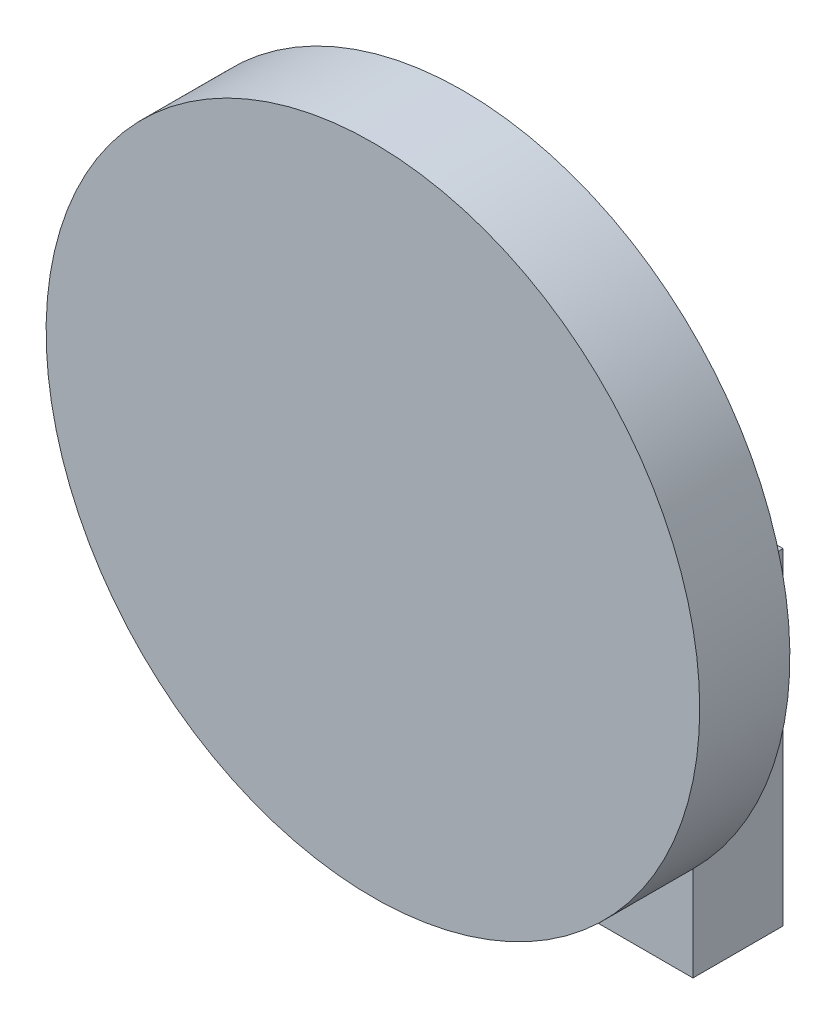
ISO-10303-21;
HEADER;
FILE_DESCRIPTION(('STEP AP214'),'2;1');
FILE_NAME('part.step','',(''),(''),'','','');
FILE_SCHEMA(('AUTOMOTIVE_DESIGN { 1 0 10303 214 1 1 1 1 }'));
ENDSEC;
DATA;
#1=APPLICATION_CONTEXT('core data for automotive mechanical design processes');
#2=APPLICATION_PROTOCOL_DEFINITION('international standard','automotive_design',2000,#1);
#3=PRODUCT_CONTEXT('',#1,'mechanical');
#4=PRODUCT('Part','Part','',(#3));
#5=PRODUCT_RELATED_PRODUCT_CATEGORY('part','',(#4));
#6=PRODUCT_DEFINITION_FORMATION('','',#4);
#7=PRODUCT_DEFINITION_CONTEXT('part definition',#1,'design');
#8=PRODUCT_DEFINITION('design','',#6,#7);
#9=PRODUCT_DEFINITION_SHAPE('','',#8);
#10=(LENGTH_UNIT() NAMED_UNIT(*) SI_UNIT(.MILLI.,.METRE.));
#11=(NAMED_UNIT(*) PLANE_ANGLE_UNIT() SI_UNIT($,.RADIAN.));
#12=(NAMED_UNIT(*) SI_UNIT($,.STERADIAN.) SOLID_ANGLE_UNIT());
#13=UNCERTAINTY_MEASURE_WITH_UNIT(LENGTH_MEASURE(1.E-05),#10,'distance_accuracy_value','');
#14=(GEOMETRIC_REPRESENTATION_CONTEXT(3) GLOBAL_UNCERTAINTY_ASSIGNED_CONTEXT((#13)) GLOBAL_UNIT_ASSIGNED_CONTEXT((#10,
#11,#12)) REPRESENTATION_CONTEXT('',''));
#15=CARTESIAN_POINT('',(0.,0.,0.));
#16=DIRECTION('',(0.,0.,1.));
#17=DIRECTION('',(1.,0.,0.));
#18=AXIS2_PLACEMENT_3D('',#15,#16,#17);
#19=CARTESIAN_POINT('',(0.,0.,2.));
#20=DIRECTION('',(0.,0.,1.));
#21=DIRECTION('',(1.,0.,0.));
#22=AXIS2_PLACEMENT_3D('',#19,#20,#21);
#23=PLANE('',#22);
#24=CARTESIAN_POINT('',(-5.1,7.25,2.));
#25=DIRECTION('',(0.,0.,1.));
#26=DIRECTION('',(1.,0.,0.));
#27=AXIS2_PLACEMENT_3D('',#24,#25,#26);
#28=CIRCLE('',#27,7.25);
#29=CARTESIAN_POINT('',(-10.2,2.09708820180279,2.));
#30=VERTEX_POINT('',#29);
#31=CARTESIAN_POINT('',(-5.1,0.,2.));
#32=VERTEX_POINT('',#31);
#33=EDGE_CURVE('E43',#30,#32,#28,.T.);
#34=ORIENTED_EDGE('',*,*,#33,.F.);
#35=DIRECTION('',(0.,1.,0.));
#36=VECTOR('',#35,1.);
#37=CARTESIAN_POINT('',(-10.2,0.,2.));
#38=LINE('',#37,#36);
#39=CARTESIAN_POINT('',(-10.2,0.,2.));
#40=VERTEX_POINT('',#39);
#41=EDGE_CURVE('E112',#40,#30,#38,.T.);
#42=ORIENTED_EDGE('',*,*,#41,.F.);
#43=DIRECTION('',(-1.,0.,0.));
#44=VECTOR('',#43,1.);
#45=CARTESIAN_POINT('',(0.,0.,2.));
#46=LINE('',#45,#44);
#47=EDGE_CURVE('E114',#32,#40,#46,.T.);
#48=ORIENTED_EDGE('',*,*,#47,.F.);
#49=EDGE_LOOP('',(#34,#42,#48));
#50=FACE_BOUND('',#49,.T.);
#51=ADVANCED_FACE('F33',(#50),#23,.T.);
#52=CARTESIAN_POINT('',(0.,0.,2.));
#53=DIRECTION('',(-1.,0.,0.));
#54=DIRECTION('',(0.,-1.,0.));
#55=AXIS2_PLACEMENT_3D('',#52,#53,#54);
#56=PLANE('',#55);
#57=DIRECTION('',(0.,1.,0.));
#58=VECTOR('',#57,1.);
#59=CARTESIAN_POINT('',(0.,0.,0.));
#60=LINE('',#59,#58);
#61=CARTESIAN_POINT('',(0.,0.,0.));
#62=VERTEX_POINT('',#61);
#63=CARTESIAN_POINT('',(0.,7.25,0.));
#64=VERTEX_POINT('',#63);
#65=EDGE_CURVE('E108',#62,#64,#60,.T.);
#66=ORIENTED_EDGE('',*,*,#65,.T.);
#67=DIRECTION('',(0.,0.,-1.));
#68=VECTOR('',#67,1.);
#69=CARTESIAN_POINT('',(0.,7.25,2.));
#70=LINE('',#69,#68);
#71=CARTESIAN_POINT('',(0.,7.25,2.));
#72=VERTEX_POINT('',#71);
#73=EDGE_CURVE('E37',#72,#64,#70,.T.);
#74=ORIENTED_EDGE('',*,*,#73,.F.);
#75=DIRECTION('',(0.,1.,0.));
#76=VECTOR('',#75,1.);
#77=CARTESIAN_POINT('',(0.,0.,2.));
#78=LINE('',#77,#76);
#79=CARTESIAN_POINT('',(0.,2.09708820180279,2.));
#80=VERTEX_POINT('',#79);
#81=EDGE_CURVE('E90',#80,#72,#78,.T.);
#82=ORIENTED_EDGE('',*,*,#81,.F.);
#83=CARTESIAN_POINT('',(0.,0.,2.));
#84=VERTEX_POINT('',#83);
#85=EDGE_CURVE('E83',#84,#80,#78,.T.);
#86=ORIENTED_EDGE('',*,*,#85,.F.);
#87=DIRECTION('',(0.,0.,-1.));
#88=VECTOR('',#87,1.);
#89=CARTESIAN_POINT('',(0.,0.,2.));
#90=LINE('',#89,#88);
#91=EDGE_CURVE('E116',#84,#62,#90,.T.);
#92=ORIENTED_EDGE('',*,*,#91,.T.);
#93=EDGE_LOOP('',(#66,#74,#82,#86,#92));
#94=FACE_BOUND('',#93,.T.);
#95=ADVANCED_FACE('F35',(#94),#56,.F.);
#96=CARTESIAN_POINT('',(0.,7.25,2.));
#97=DIRECTION('',(0.,-1.,0.));
#98=DIRECTION('',(1.,0.,0.));
#99=AXIS2_PLACEMENT_3D('',#96,#97,#98);
#100=PLANE('',#99);
#101=DIRECTION('',(-1.,0.,0.));
#102=VECTOR('',#101,1.);
#103=CARTESIAN_POINT('',(0.,7.25,0.));
#104=LINE('',#103,#102);
#105=CARTESIAN_POINT('',(-10.2,7.25,0.));
#106=VERTEX_POINT('',#105);
#107=EDGE_CURVE('E118',#64,#106,#104,.T.);
#108=ORIENTED_EDGE('',*,*,#107,.T.);
#109=DIRECTION('',(0.,0.,-1.));
#110=VECTOR('',#109,1.);
#111=CARTESIAN_POINT('',(-10.2,7.25,2.));
#112=LINE('',#111,#110);
#113=CARTESIAN_POINT('',(-10.2,7.25,2.));
#114=VERTEX_POINT('',#113);
#115=EDGE_CURVE('E128',#114,#106,#112,.T.);
#116=ORIENTED_EDGE('',*,*,#115,.F.);
#117=DIRECTION('',(-1.,0.,0.));
#118=VECTOR('',#117,1.);
#119=CARTESIAN_POINT('',(0.,7.25,2.));
#120=LINE('',#119,#118);
#121=EDGE_CURVE('E89',#72,#114,#120,.T.);
#122=ORIENTED_EDGE('',*,*,#121,.F.);
#123=ORIENTED_EDGE('',*,*,#73,.T.);
#124=EDGE_LOOP('',(#108,#116,#122,#123));
#125=FACE_BOUND('',#124,.T.);
#126=ADVANCED_FACE('F133',(#125),#100,.F.);
#127=CARTESIAN_POINT('',(-10.2,0.,2.));
#128=DIRECTION('',(-1.,0.,0.));
#129=DIRECTION('',(0.,0.,1.));
#130=AXIS2_PLACEMENT_3D('',#127,#128,#129);
#131=PLANE('',#130);
#132=DIRECTION('',(0.,1.,0.));
#133=VECTOR('',#132,1.);
#134=CARTESIAN_POINT('',(-10.2,0.,0.));
#135=LINE('',#134,#133);
#136=CARTESIAN_POINT('',(-10.2,0.,0.));
#137=VERTEX_POINT('',#136);
#138=EDGE_CURVE('E121',#137,#106,#135,.T.);
#139=ORIENTED_EDGE('',*,*,#138,.F.);
#140=DIRECTION('',(0.,0.,-1.));
#141=VECTOR('',#140,1.);
#142=CARTESIAN_POINT('',(-10.2,0.,2.));
#143=LINE('',#142,#141);
#144=EDGE_CURVE('E127',#40,#137,#143,.T.);
#145=ORIENTED_EDGE('',*,*,#144,.F.);
#146=ORIENTED_EDGE('',*,*,#41,.T.);
#147=EDGE_CURVE('E103',#30,#114,#38,.T.);
#148=ORIENTED_EDGE('',*,*,#147,.T.);
#149=ORIENTED_EDGE('',*,*,#115,.T.);
#150=EDGE_LOOP('',(#139,#145,#146,#148,#149));
#151=FACE_BOUND('',#150,.T.);
#152=ADVANCED_FACE('F141',(#151),#131,.T.);
#153=CARTESIAN_POINT('',(0.,0.,2.));
#154=DIRECTION('',(0.,-1.,0.));
#155=DIRECTION('',(0.,0.,-1.));
#156=AXIS2_PLACEMENT_3D('',#153,#154,#155);
#157=PLANE('',#156);
#158=DIRECTION('',(-1.,0.,0.));
#159=VECTOR('',#158,1.);
#160=CARTESIAN_POINT('',(0.,0.,0.));
#161=LINE('',#160,#159);
#162=EDGE_CURVE('E99',#62,#137,#161,.T.);
#163=ORIENTED_EDGE('',*,*,#162,.F.);
#164=ORIENTED_EDGE('',*,*,#91,.F.);
#165=EDGE_CURVE('E87',#84,#32,#46,.T.);
#166=ORIENTED_EDGE('',*,*,#165,.T.);
#167=ORIENTED_EDGE('',*,*,#47,.T.);
#168=ORIENTED_EDGE('',*,*,#144,.T.);
#169=EDGE_LOOP('',(#163,#164,#166,#167,#168));
#170=FACE_BOUND('',#169,.T.);
#171=ADVANCED_FACE('F139',(#170),#157,.T.);
#172=EDGE_CURVE('E11',#32,#80,#28,.T.);
#173=ORIENTED_EDGE('',*,*,#172,.F.);
#174=ORIENTED_EDGE('',*,*,#165,.F.);
#175=ORIENTED_EDGE('',*,*,#85,.T.);
#176=EDGE_LOOP('',(#173,#174,#175));
#177=FACE_BOUND('',#176,.T.);
#178=ADVANCED_FACE('F85',(#177),#23,.T.);
#179=CARTESIAN_POINT('',(0.,0.,0.));
#180=DIRECTION('',(0.,0.,1.));
#181=DIRECTION('',(1.,0.,0.));
#182=AXIS2_PLACEMENT_3D('',#179,#180,#181);
#183=PLANE('',#182);
#184=ORIENTED_EDGE('',*,*,#65,.F.);
#185=ORIENTED_EDGE('',*,*,#162,.T.);
#186=ORIENTED_EDGE('',*,*,#138,.T.);
#187=ORIENTED_EDGE('',*,*,#107,.F.);
#188=EDGE_LOOP('',(#184,#185,#186,#187));
#189=FACE_BOUND('',#188,.T.);
#190=ADVANCED_FACE('F137',(#189),#183,.F.);
#191=CARTESIAN_POINT('',(-5.1,7.25,2.));
#192=DIRECTION('',(0.,0.,1.));
#193=DIRECTION('',(1.,0.,0.));
#194=AXIS2_PLACEMENT_3D('',#191,#192,#193);
#195=PLANE('',#194);
#196=EDGE_CURVE('E44',#80,#30,#28,.T.);
#197=ORIENTED_EDGE('',*,*,#196,.F.);
#198=ORIENTED_EDGE('',*,*,#81,.T.);
#199=ORIENTED_EDGE('',*,*,#121,.T.);
#200=ORIENTED_EDGE('',*,*,#147,.F.);
#201=EDGE_LOOP('',(#197,#198,#199,#200));
#202=FACE_BOUND('',#201,.T.);
#203=ADVANCED_FACE('F102',(#202),#195,.F.);
#204=CARTESIAN_POINT('',(-5.1,7.25,4.));
#205=DIRECTION('',(0.,0.,-1.));
#206=DIRECTION('',(-1.,0.,0.));
#207=AXIS2_PLACEMENT_3D('',#204,#205,#206);
#208=CYLINDRICAL_SURFACE('',#207,7.25);
#209=CARTESIAN_POINT('',(-5.1,7.25,4.));
#210=DIRECTION('',(0.,0.,1.));
#211=DIRECTION('',(1.,0.,0.));
#212=AXIS2_PLACEMENT_3D('',#209,#210,#211);
#213=CIRCLE('',#212,7.25);
#214=CARTESIAN_POINT('',(2.15,7.25,4.));
#215=VERTEX_POINT('',#214);
#216=EDGE_CURVE('E106',#215,#215,#213,.T.);
#217=ORIENTED_EDGE('',*,*,#216,.F.);
#218=EDGE_LOOP('',(#217));
#219=FACE_BOUND('',#218,.T.);
#220=ORIENTED_EDGE('',*,*,#33,.T.);
#221=ORIENTED_EDGE('',*,*,#172,.T.);
#222=ORIENTED_EDGE('',*,*,#196,.T.);
#223=EDGE_LOOP('',(#220,#221,#222));
#224=FACE_BOUND('',#223,.T.);
#225=ADVANCED_FACE('F105',(#219,#224),#208,.T.);
#226=CARTESIAN_POINT('',(-5.1,7.25,4.));
#227=DIRECTION('',(0.,0.,1.));
#228=DIRECTION('',(1.,0.,0.));
#229=AXIS2_PLACEMENT_3D('',#226,#227,#228);
#230=PLANE('',#229);
#231=ORIENTED_EDGE('',*,*,#216,.T.);
#232=EDGE_LOOP('',(#231));
#233=FACE_BOUND('',#232,.T.);
#234=ADVANCED_FACE('F167',(#233),#230,.T.);
#235=CLOSED_SHELL('',(#51,#95,#126,#152,#171,#178,#190,#203,#225,#234));
#236=MANIFOLD_SOLID_BREP('B2',#235);
#237=ADVANCED_BREP_SHAPE_REPRESENTATION('',(#18,#236),#14);
#238=SHAPE_DEFINITION_REPRESENTATION(#9,#237);
ENDSEC;
END-ISO-10303-21;
